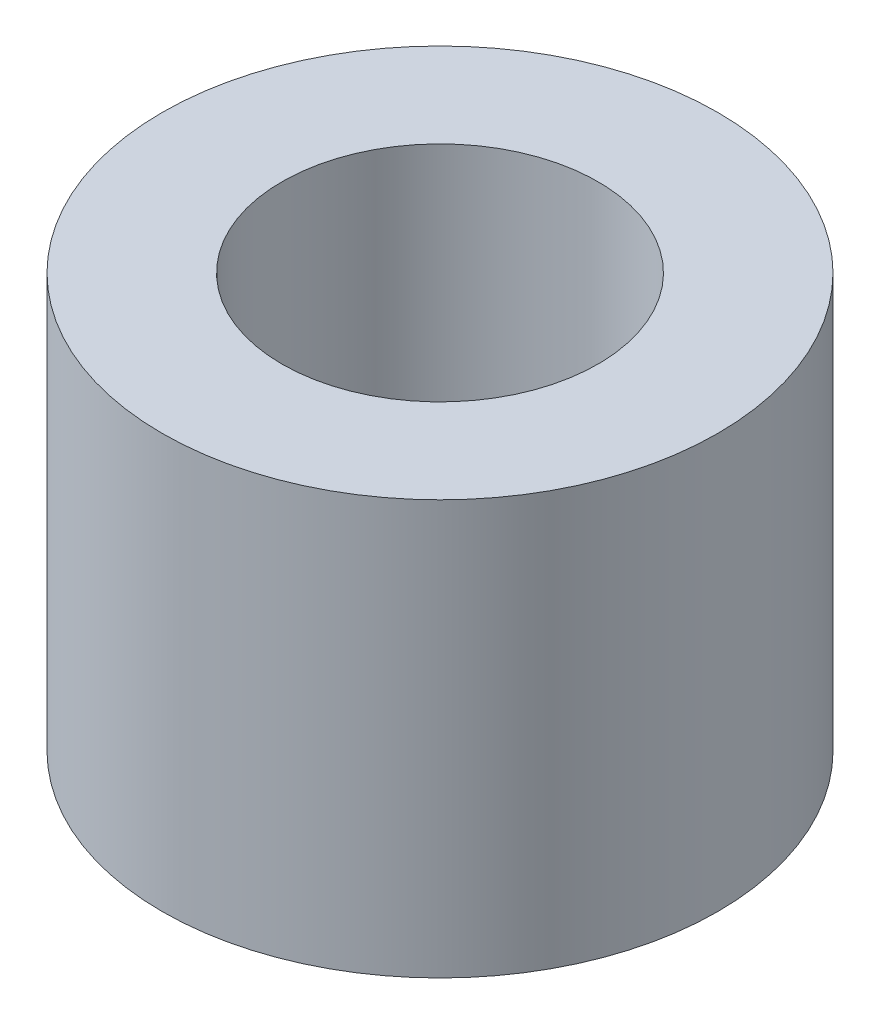
ISO-10303-21;
HEADER;
FILE_DESCRIPTION(('STEP AP214'),'2;1');
FILE_NAME('part.step','',(''),(''),'','','');
FILE_SCHEMA(('AUTOMOTIVE_DESIGN { 1 0 10303 214 1 1 1 1 }'));
ENDSEC;
DATA;
#1=APPLICATION_CONTEXT('core data for automotive mechanical design processes');
#2=APPLICATION_PROTOCOL_DEFINITION('international standard','automotive_design',2000,#1);
#3=PRODUCT_CONTEXT('',#1,'mechanical');
#4=PRODUCT('Part','Part','',(#3));
#5=PRODUCT_RELATED_PRODUCT_CATEGORY('part','',(#4));
#6=PRODUCT_DEFINITION_FORMATION('','',#4);
#7=PRODUCT_DEFINITION_CONTEXT('part definition',#1,'design');
#8=PRODUCT_DEFINITION('design','',#6,#7);
#9=PRODUCT_DEFINITION_SHAPE('','',#8);
#10=(LENGTH_UNIT() NAMED_UNIT(*) SI_UNIT(.MILLI.,.METRE.));
#11=(NAMED_UNIT(*) PLANE_ANGLE_UNIT() SI_UNIT($,.RADIAN.));
#12=(NAMED_UNIT(*) SI_UNIT($,.STERADIAN.) SOLID_ANGLE_UNIT());
#13=UNCERTAINTY_MEASURE_WITH_UNIT(LENGTH_MEASURE(1.E-05),#10,'distance_accuracy_value','');
#14=(GEOMETRIC_REPRESENTATION_CONTEXT(3) GLOBAL_UNCERTAINTY_ASSIGNED_CONTEXT((#13)) GLOBAL_UNIT_ASSIGNED_CONTEXT((#10,
#11,#12)) REPRESENTATION_CONTEXT('',''));
#15=CARTESIAN_POINT('',(0.,0.,0.));
#16=DIRECTION('',(0.,0.,1.));
#17=DIRECTION('',(1.,0.,0.));
#18=AXIS2_PLACEMENT_3D('',#15,#16,#17);
#19=CARTESIAN_POINT('',(0.,16.8068181818182,0.));
#20=DIRECTION('',(0.,1.,0.));
#21=DIRECTION('',(0.,0.,1.));
#22=AXIS2_PLACEMENT_3D('',#19,#20,#21);
#23=CYLINDRICAL_SURFACE('',#22,12.75);
#24=CARTESIAN_POINT('',(0.,-9.5,0.));
#25=DIRECTION('',(0.,1.,0.));
#26=DIRECTION('',(0.,0.,1.));
#27=AXIS2_PLACEMENT_3D('',#24,#25,#26);
#28=CIRCLE('',#27,12.75);
#29=CARTESIAN_POINT('',(0.,-9.5,12.75));
#30=VERTEX_POINT('',#29);
#31=EDGE_CURVE('E10',#30,#30,#28,.T.);
#32=ORIENTED_EDGE('',*,*,#31,.T.);
#33=EDGE_LOOP('',(#32));
#34=FACE_BOUND('',#33,.T.);
#35=CARTESIAN_POINT('',(0.,9.5,0.));
#36=DIRECTION('',(0.,1.,0.));
#37=DIRECTION('',(0.,0.,1.));
#38=AXIS2_PLACEMENT_3D('',#35,#36,#37);
#39=CIRCLE('',#38,12.75);
#40=CARTESIAN_POINT('',(0.,9.5,12.75));
#41=VERTEX_POINT('',#40);
#42=EDGE_CURVE('E53',#41,#41,#39,.T.);
#43=ORIENTED_EDGE('',*,*,#42,.F.);
#44=EDGE_LOOP('',(#43));
#45=FACE_BOUND('',#44,.T.);
#46=ADVANCED_FACE('F35',(#34,#45),#23,.T.);
#47=CARTESIAN_POINT('',(0.,-9.5,12.75));
#48=DIRECTION('',(0.,-1.,0.));
#49=DIRECTION('',(0.,0.,-1.));
#50=AXIS2_PLACEMENT_3D('',#47,#48,#49);
#51=PLANE('',#50);
#52=CARTESIAN_POINT('',(0.,-9.5,0.));
#53=DIRECTION('',(0.,1.,0.));
#54=DIRECTION('',(0.,0.,1.));
#55=AXIS2_PLACEMENT_3D('',#52,#53,#54);
#56=CIRCLE('',#55,7.25);
#57=CARTESIAN_POINT('',(0.,-9.5,7.25));
#58=VERTEX_POINT('',#57);
#59=EDGE_CURVE('E42',#58,#58,#56,.T.);
#60=ORIENTED_EDGE('',*,*,#59,.T.);
#61=EDGE_LOOP('',(#60));
#62=FACE_BOUND('',#61,.T.);
#63=ORIENTED_EDGE('',*,*,#31,.F.);
#64=EDGE_LOOP('',(#63));
#65=FACE_BOUND('',#64,.T.);
#66=ADVANCED_FACE('F63',(#62,#65),#51,.T.);
#67=CARTESIAN_POINT('',(0.,16.8068181818182,0.));
#68=DIRECTION('',(0.,1.,0.));
#69=DIRECTION('',(0.,0.,1.));
#70=AXIS2_PLACEMENT_3D('',#67,#68,#69);
#71=CYLINDRICAL_SURFACE('',#70,7.25);
#72=CARTESIAN_POINT('',(0.,9.5,0.));
#73=DIRECTION('',(0.,1.,0.));
#74=DIRECTION('',(0.,0.,1.));
#75=AXIS2_PLACEMENT_3D('',#72,#73,#74);
#76=CIRCLE('',#75,7.25);
#77=CARTESIAN_POINT('',(0.,9.5,7.25));
#78=VERTEX_POINT('',#77);
#79=EDGE_CURVE('E49',#78,#78,#76,.T.);
#80=ORIENTED_EDGE('',*,*,#79,.T.);
#81=EDGE_LOOP('',(#80));
#82=FACE_BOUND('',#81,.T.);
#83=ORIENTED_EDGE('',*,*,#59,.F.);
#84=EDGE_LOOP('',(#83));
#85=FACE_BOUND('',#84,.T.);
#86=ADVANCED_FACE('F67',(#82,#85),#71,.F.);
#87=CARTESIAN_POINT('',(0.,9.5,12.75));
#88=DIRECTION('',(0.,1.,0.));
#89=DIRECTION('',(0.,0.,1.));
#90=AXIS2_PLACEMENT_3D('',#87,#88,#89);
#91=PLANE('',#90);
#92=ORIENTED_EDGE('',*,*,#42,.T.);
#93=EDGE_LOOP('',(#92));
#94=FACE_BOUND('',#93,.T.);
#95=ORIENTED_EDGE('',*,*,#79,.F.);
#96=EDGE_LOOP('',(#95));
#97=FACE_BOUND('',#96,.T.);
#98=ADVANCED_FACE('F59',(#94,#97),#91,.T.);
#99=CLOSED_SHELL('',(#46,#66,#86,#98));
#100=MANIFOLD_SOLID_BREP('B2',#99);
#101=ADVANCED_BREP_SHAPE_REPRESENTATION('',(#18,#100),#14);
#102=SHAPE_DEFINITION_REPRESENTATION(#9,#101);
ENDSEC;
END-ISO-10303-21;
